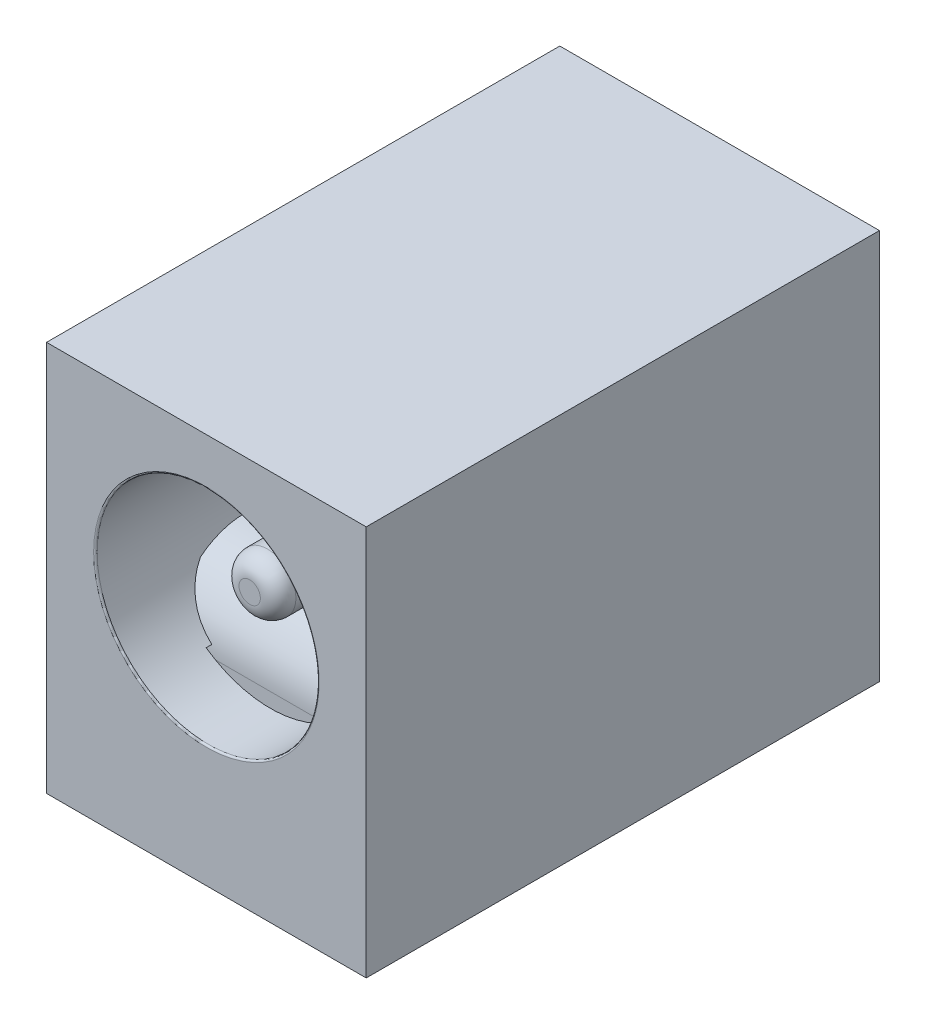
ISO-10303-21;
HEADER;
FILE_DESCRIPTION(('STEP AP214'),'2;1');
FILE_NAME('part.step','',(''),(''),'','','');
FILE_SCHEMA(('AUTOMOTIVE_DESIGN { 1 0 10303 214 1 1 1 1 }'));
ENDSEC;
DATA;
#1=APPLICATION_CONTEXT('core data for automotive mechanical design processes');
#2=APPLICATION_PROTOCOL_DEFINITION('international standard','automotive_design',2000,#1);
#3=PRODUCT_CONTEXT('',#1,'mechanical');
#4=PRODUCT('Part','Part','',(#3));
#5=PRODUCT_RELATED_PRODUCT_CATEGORY('part','',(#4));
#6=PRODUCT_DEFINITION_FORMATION('','',#4);
#7=PRODUCT_DEFINITION_CONTEXT('part definition',#1,'design');
#8=PRODUCT_DEFINITION('design','',#6,#7);
#9=PRODUCT_DEFINITION_SHAPE('','',#8);
#10=(LENGTH_UNIT() NAMED_UNIT(*) SI_UNIT(.MILLI.,.METRE.));
#11=(NAMED_UNIT(*) PLANE_ANGLE_UNIT() SI_UNIT($,.RADIAN.));
#12=(NAMED_UNIT(*) SI_UNIT($,.STERADIAN.) SOLID_ANGLE_UNIT());
#13=UNCERTAINTY_MEASURE_WITH_UNIT(LENGTH_MEASURE(1.E-05),#10,'distance_accuracy_value','');
#14=(GEOMETRIC_REPRESENTATION_CONTEXT(3) GLOBAL_UNCERTAINTY_ASSIGNED_CONTEXT((#13)) GLOBAL_UNIT_ASSIGNED_CONTEXT((#10,
#11,#12)) REPRESENTATION_CONTEXT('',''));
#15=CARTESIAN_POINT('',(0.,0.,0.));
#16=DIRECTION('',(0.,0.,1.));
#17=DIRECTION('',(1.,0.,0.));
#18=AXIS2_PLACEMENT_3D('',#15,#16,#17);
#19=CARTESIAN_POINT('',(9.,-5.5,-7.225));
#20=DIRECTION('',(0.,0.,1.));
#21=DIRECTION('',(1.,0.,0.));
#22=AXIS2_PLACEMENT_3D('',#19,#20,#21);
#23=PLANE('',#22);
#24=DIRECTION('',(0.,1.,0.));
#25=VECTOR('',#24,1.);
#26=CARTESIAN_POINT('',(0.,-5.5,-7.225));
#27=LINE('',#26,#25);
#28=CARTESIAN_POINT('',(0.,-5.5,-7.225));
#29=VERTEX_POINT('',#28);
#30=CARTESIAN_POINT('',(0.,5.5,-7.225));
#31=VERTEX_POINT('',#30);
#32=EDGE_CURVE('E268',#29,#31,#27,.T.);
#33=ORIENTED_EDGE('',*,*,#32,.T.);
#34=DIRECTION('',(-1.,0.,0.));
#35=VECTOR('',#34,1.);
#36=CARTESIAN_POINT('',(9.,5.5,-7.225));
#37=LINE('',#36,#35);
#38=CARTESIAN_POINT('',(9.,5.5,-7.225));
#39=VERTEX_POINT('',#38);
#40=EDGE_CURVE('E295',#39,#31,#37,.T.);
#41=ORIENTED_EDGE('',*,*,#40,.F.);
#42=DIRECTION('',(0.,1.,0.));
#43=VECTOR('',#42,1.);
#44=CARTESIAN_POINT('',(9.,-5.5,-7.225));
#45=LINE('',#44,#43);
#46=CARTESIAN_POINT('',(9.,-5.5,-7.225));
#47=VERTEX_POINT('',#46);
#48=EDGE_CURVE('E269',#47,#39,#45,.T.);
#49=ORIENTED_EDGE('',*,*,#48,.F.);
#50=DIRECTION('',(-1.,0.,0.));
#51=VECTOR('',#50,1.);
#52=CARTESIAN_POINT('',(9.,-5.5,-7.225));
#53=LINE('',#52,#51);
#54=EDGE_CURVE('E279',#47,#29,#53,.T.);
#55=ORIENTED_EDGE('',*,*,#54,.T.);
#56=EDGE_LOOP('',(#33,#41,#49,#55));
#57=FACE_BOUND('',#56,.T.);
#58=ADVANCED_FACE('F35',(#57),#23,.F.);
#59=CARTESIAN_POINT('',(9.,5.5,7.225));
#60=DIRECTION('',(0.,-1.,0.));
#61=DIRECTION('',(0.,0.,-1.));
#62=AXIS2_PLACEMENT_3D('',#59,#60,#61);
#63=PLANE('',#62);
#64=DIRECTION('',(0.,0.,1.));
#65=VECTOR('',#64,1.);
#66=CARTESIAN_POINT('',(0.,5.5,7.225));
#67=LINE('',#66,#65);
#68=CARTESIAN_POINT('',(0.,5.5,7.225));
#69=VERTEX_POINT('',#68);
#70=EDGE_CURVE('E282',#31,#69,#67,.T.);
#71=ORIENTED_EDGE('',*,*,#70,.T.);
#72=DIRECTION('',(-1.,0.,0.));
#73=VECTOR('',#72,1.);
#74=CARTESIAN_POINT('',(9.,5.5,7.225));
#75=LINE('',#74,#73);
#76=CARTESIAN_POINT('',(9.,5.5,7.225));
#77=VERTEX_POINT('',#76);
#78=EDGE_CURVE('E292',#77,#69,#75,.T.);
#79=ORIENTED_EDGE('',*,*,#78,.F.);
#80=DIRECTION('',(0.,0.,1.));
#81=VECTOR('',#80,1.);
#82=CARTESIAN_POINT('',(9.,5.5,7.225));
#83=LINE('',#82,#81);
#84=EDGE_CURVE('E272',#39,#77,#83,.T.);
#85=ORIENTED_EDGE('',*,*,#84,.F.);
#86=ORIENTED_EDGE('',*,*,#40,.T.);
#87=EDGE_LOOP('',(#71,#79,#85,#86));
#88=FACE_BOUND('',#87,.T.);
#89=ADVANCED_FACE('F376',(#88),#63,.F.);
#90=CARTESIAN_POINT('',(9.,-5.5,7.225));
#91=DIRECTION('',(0.,0.,-1.));
#92=DIRECTION('',(-1.,0.,0.));
#93=AXIS2_PLACEMENT_3D('',#90,#91,#92);
#94=PLANE('',#93);
#95=CARTESIAN_POINT('',(4.5,1.05,7.225));
#96=DIRECTION('',(0.,0.,-1.));
#97=DIRECTION('',(-1.,0.,0.));
#98=AXIS2_PLACEMENT_3D('',#95,#96,#97);
#99=CIRCLE('',#98,3.175);
#100=CARTESIAN_POINT('',(1.325,1.05,7.225));
#101=VERTEX_POINT('',#100);
#102=EDGE_CURVE('E307',#101,#101,#99,.T.);
#103=ORIENTED_EDGE('',*,*,#102,.T.);
#104=EDGE_LOOP('',(#103));
#105=FACE_BOUND('',#104,.T.);
#106=DIRECTION('',(0.,-1.,0.));
#107=VECTOR('',#106,1.);
#108=CARTESIAN_POINT('',(0.,-5.5,7.225));
#109=LINE('',#108,#107);
#110=CARTESIAN_POINT('',(0.,-5.5,7.225));
#111=VERTEX_POINT('',#110);
#112=EDGE_CURVE('E284',#69,#111,#109,.T.);
#113=ORIENTED_EDGE('',*,*,#112,.T.);
#114=DIRECTION('',(-1.,0.,0.));
#115=VECTOR('',#114,1.);
#116=CARTESIAN_POINT('',(9.,-5.5,7.225));
#117=LINE('',#116,#115);
#118=CARTESIAN_POINT('',(9.,-5.5,7.225));
#119=VERTEX_POINT('',#118);
#120=EDGE_CURVE('E289',#119,#111,#117,.T.);
#121=ORIENTED_EDGE('',*,*,#120,.F.);
#122=DIRECTION('',(0.,-1.,0.));
#123=VECTOR('',#122,1.);
#124=CARTESIAN_POINT('',(9.,-5.5,7.225));
#125=LINE('',#124,#123);
#126=EDGE_CURVE('E275',#77,#119,#125,.T.);
#127=ORIENTED_EDGE('',*,*,#126,.F.);
#128=ORIENTED_EDGE('',*,*,#78,.T.);
#129=EDGE_LOOP('',(#113,#121,#127,#128));
#130=FACE_BOUND('',#129,.T.);
#131=ADVANCED_FACE('F380',(#105,#130),#94,.F.);
#132=CARTESIAN_POINT('',(9.,-5.5,7.225));
#133=DIRECTION('',(0.,1.,0.));
#134=DIRECTION('',(0.,0.,1.));
#135=AXIS2_PLACEMENT_3D('',#132,#133,#134);
#136=PLANE('',#135);
#137=DIRECTION('',(-1.,0.,0.));
#138=VECTOR('',#137,1.);
#139=CARTESIAN_POINT('',(1.5,-5.5,5.425));
#140=LINE('',#139,#138);
#141=CARTESIAN_POINT('',(7.5,-5.5,5.425));
#142=VERTEX_POINT('',#141);
#143=CARTESIAN_POINT('',(1.5,-5.5,5.425));
#144=VERTEX_POINT('',#143);
#145=EDGE_CURVE('E246',#142,#144,#140,.T.);
#146=ORIENTED_EDGE('',*,*,#145,.F.);
#147=DIRECTION('',(0.,0.,1.));
#148=VECTOR('',#147,1.);
#149=CARTESIAN_POINT('',(7.5,-5.5,-0.575));
#150=LINE('',#149,#148);
#151=CARTESIAN_POINT('',(7.5,-5.5,-0.575));
#152=VERTEX_POINT('',#151);
#153=EDGE_CURVE('E229',#152,#142,#150,.T.);
#154=ORIENTED_EDGE('',*,*,#153,.F.);
#155=DIRECTION('',(1.,0.,0.));
#156=VECTOR('',#155,1.);
#157=CARTESIAN_POINT('',(1.5,-5.5,-0.575000000000001));
#158=LINE('',#157,#156);
#159=CARTESIAN_POINT('',(1.5,-5.5,-0.575000000000001));
#160=VERTEX_POINT('',#159);
#161=EDGE_CURVE('E234',#160,#152,#158,.T.);
#162=ORIENTED_EDGE('',*,*,#161,.F.);
#163=DIRECTION('',(0.,0.,-1.));
#164=VECTOR('',#163,1.);
#165=CARTESIAN_POINT('',(1.5,-5.5,5.425));
#166=LINE('',#165,#164);
#167=EDGE_CURVE('E249',#144,#160,#166,.T.);
#168=ORIENTED_EDGE('',*,*,#167,.F.);
#169=EDGE_LOOP('',(#146,#154,#162,#168));
#170=FACE_BOUND('',#169,.T.);
#171=DIRECTION('',(0.,0.,-1.));
#172=VECTOR('',#171,1.);
#173=CARTESIAN_POINT('',(0.,-5.5,7.225));
#174=LINE('',#173,#172);
#175=EDGE_CURVE('E273',#111,#29,#174,.T.);
#176=ORIENTED_EDGE('',*,*,#175,.T.);
#177=ORIENTED_EDGE('',*,*,#54,.F.);
#178=DIRECTION('',(0.,0.,-1.));
#179=VECTOR('',#178,1.);
#180=CARTESIAN_POINT('',(9.,-5.5,7.225));
#181=LINE('',#180,#179);
#182=EDGE_CURVE('E277',#119,#47,#181,.T.);
#183=ORIENTED_EDGE('',*,*,#182,.F.);
#184=ORIENTED_EDGE('',*,*,#120,.T.);
#185=EDGE_LOOP('',(#176,#177,#183,#184));
#186=FACE_BOUND('',#185,.T.);
#187=ADVANCED_FACE('F384',(#170,#186),#136,.F.);
#188=CARTESIAN_POINT('',(9.,0.,0.));
#189=DIRECTION('',(-1.,0.,0.));
#190=DIRECTION('',(0.,0.,1.));
#191=AXIS2_PLACEMENT_3D('',#188,#189,#190);
#192=PLANE('',#191);
#193=ORIENTED_EDGE('',*,*,#48,.T.);
#194=ORIENTED_EDGE('',*,*,#84,.T.);
#195=ORIENTED_EDGE('',*,*,#126,.T.);
#196=ORIENTED_EDGE('',*,*,#182,.T.);
#197=EDGE_LOOP('',(#193,#194,#195,#196));
#198=FACE_BOUND('',#197,.T.);
#199=ADVANCED_FACE('F388',(#198),#192,.F.);
#200=CARTESIAN_POINT('',(0.,0.,0.));
#201=DIRECTION('',(-1.,0.,0.));
#202=DIRECTION('',(0.,0.,1.));
#203=AXIS2_PLACEMENT_3D('',#200,#201,#202);
#204=PLANE('',#203);
#205=ORIENTED_EDGE('',*,*,#32,.F.);
#206=ORIENTED_EDGE('',*,*,#175,.F.);
#207=ORIENTED_EDGE('',*,*,#112,.F.);
#208=ORIENTED_EDGE('',*,*,#70,.F.);
#209=EDGE_LOOP('',(#205,#206,#207,#208));
#210=FACE_BOUND('',#209,.T.);
#211=ADVANCED_FACE('F390',(#210),#204,.T.);
#212=CARTESIAN_POINT('',(4.5,1.05,-1.705));
#213=DIRECTION('',(0.,0.,1.));
#214=DIRECTION('',(1.,0.,0.));
#215=AXIS2_PLACEMENT_3D('',#212,#213,#214);
#216=CYLINDRICAL_SURFACE('',#215,3.125);
#217=DIRECTION('',(0.,0.,1.));
#218=VECTOR('',#217,1.);
#219=CARTESIAN_POINT('',(6.30641218995001,-1.5,-1.705));
#220=LINE('',#219,#218);
#221=CARTESIAN_POINT('',(6.30641218995001,-1.5,-0.575));
#222=VERTEX_POINT('',#221);
#223=CARTESIAN_POINT('',(6.30641218995001,-1.5,-0.139860175548464));
#224=VERTEX_POINT('',#223);
#225=EDGE_CURVE('E57',#222,#224,#220,.T.);
#226=ORIENTED_EDGE('',*,*,#225,.T.);
#227=CARTESIAN_POINT('',(4.5,1.05,2.41013982445155));
#228=DIRECTION('',(0.,-0.707106781186549,0.707106781186546));
#229=DIRECTION('',(0.,0.707106781186546,0.707106781186549));
#230=AXIS2_PLACEMENT_3D('',#227,#228,#229);
#231=ELLIPSE('',#230,4.41941738241593,3.125);
#232=CARTESIAN_POINT('',(7.34426206933214,-0.244526276658168,1.11561354779337));
#233=VERTEX_POINT('',#232);
#234=EDGE_CURVE('E682',#224,#233,#231,.T.);
#235=ORIENTED_EDGE('',*,*,#234,.T.);
#236=DIRECTION('',(0.,0.,1.));
#237=VECTOR('',#236,1.);
#238=CARTESIAN_POINT('',(7.34426206933214,-0.244526276658168,-1.705));
#239=LINE('',#238,#237);
#240=CARTESIAN_POINT('',(7.34426206933214,-0.244526276658168,4.54704015311456));
#241=VERTEX_POINT('',#240);
#242=EDGE_CURVE('E221',#233,#241,#239,.T.);
#243=ORIENTED_EDGE('',*,*,#242,.T.);
#244=CARTESIAN_POINT('',(7.34426206933214,-0.244526276658168,4.54704015311456));
#245=CARTESIAN_POINT('',(7.32977712286333,-0.276360498626651,4.5864487091247));
#246=CARTESIAN_POINT('',(7.3140510822251,-0.309487116734059,4.62435313110626));
#247=CARTESIAN_POINT('',(7.2799954378134,-0.377831228575323,4.69695172335189));
#248=CARTESIAN_POINT('',(7.2616665473887,-0.413048147897698,4.73164676890401));
#249=CARTESIAN_POINT('',(7.22245324608999,-0.484772769270469,4.79734948460224));
#250=CARTESIAN_POINT('',(7.20159331175849,-0.52126600689631,4.82838752256777));
#251=CARTESIAN_POINT('',(7.15714916659731,-0.595312773892422,4.88703355541006));
#252=CARTESIAN_POINT('',(7.13356501292843,-0.632866281003154,4.9146416222308));
#253=CARTESIAN_POINT('',(7.05868523325267,-0.746363970367752,4.99227770838217));
#254=CARTESIAN_POINT('',(7.0032404690322,-0.82318650434868,5.03715440745007));
#255=CARTESIAN_POINT('',(6.8818690230584,-0.975301085177353,5.11391769327025));
#256=CARTESIAN_POINT('',(6.81590942233331,-1.05058745886503,5.14576232476864));
#257=CARTESIAN_POINT('',(6.67927325160331,-1.19174746589942,5.19650619139381));
#258=CARTESIAN_POINT('',(6.60915060053927,-1.25791530739224,5.21609112512709));
#259=CARTESIAN_POINT('',(6.49902952129858,-1.35246664834463,5.23941511975895));
#260=CARTESIAN_POINT('',(6.46157302268807,-1.38314823325014,5.24617398065689));
#261=CARTESIAN_POINT('',(6.38512046407508,-1.44284904852082,5.25794693589033));
#262=CARTESIAN_POINT('',(6.34612512724507,-1.47186904439304,5.26296183917249));
#263=CARTESIAN_POINT('',(6.30641218995001,-1.5,5.26723216887698));
#264=B_SPLINE_CURVE_WITH_KNOTS('',3,(#244,#245,#246,#247,#248,#249,#250,#251,#252,#253,#254,
#255,#256,#257,#258,#259,#260,#261,#262,#263),.UNSPECIFIED.,.F.,.F.,(4,2,2,2,2,2,2,2,2,4),(0.,
0.158015379323385,0.315987535517659,0.472538368343611,0.629085916945781,0.94200521721165,
1.25592414716176,1.5501879582617,1.69678175368278,1.84330745958371),.UNSPECIFIED.);
#265=CARTESIAN_POINT('',(6.30641218995001,-1.5,5.26723216887698));
#266=VERTEX_POINT('',#265);
#267=EDGE_CURVE('E348',#241,#266,#264,.T.);
#268=ORIENTED_EDGE('',*,*,#267,.T.);
#269=CARTESIAN_POINT('',(6.30641218995001,-1.5,5.425));
#270=VERTEX_POINT('',#269);
#271=EDGE_CURVE('E310',#266,#270,#220,.T.);
#272=ORIENTED_EDGE('',*,*,#271,.T.);
#273=CARTESIAN_POINT('',(4.5,1.05,5.425));
#274=DIRECTION('',(0.,0.,1.));
#275=DIRECTION('',(1.,0.,0.));
#276=AXIS2_PLACEMENT_3D('',#273,#274,#275);
#277=CIRCLE('',#276,3.125);
#278=CARTESIAN_POINT('',(2.69358781004999,-1.5,5.425));
#279=VERTEX_POINT('',#278);
#280=EDGE_CURVE('E312',#270,#279,#277,.F.);
#281=ORIENTED_EDGE('',*,*,#280,.T.);
#282=DIRECTION('',(0.,0.,1.));
#283=VECTOR('',#282,1.);
#284=CARTESIAN_POINT('',(2.69358781004999,-1.5,-1.705));
#285=LINE('',#284,#283);
#286=CARTESIAN_POINT('',(2.69358781004999,-1.5,5.26723216887698));
#287=VERTEX_POINT('',#286);
#288=EDGE_CURVE('E317',#279,#287,#285,.F.);
#289=ORIENTED_EDGE('',*,*,#288,.T.);
#290=CARTESIAN_POINT('',(2.69358781004999,-1.5,5.26723216887698));
#291=CARTESIAN_POINT('',(2.6428784769676,-1.46409139608874,5.26178088311461));
#292=CARTESIAN_POINT('',(2.59332300916467,-1.42670178931252,5.25511024528208));
#293=CARTESIAN_POINT('',(2.49675069740831,-1.34925722822402,5.23880944580129));
#294=CARTESIAN_POINT('',(2.44973717599444,-1.30919893132651,5.22917551582361));
#295=CARTESIAN_POINT('',(2.35842364500268,-1.22663803388993,5.20639195864334));
#296=CARTESIAN_POINT('',(2.31413556498096,-1.18412607562432,5.19322806365912));
#297=CARTESIAN_POINT('',(2.22882161910966,-1.09734277975819,5.16292918241532));
#298=CARTESIAN_POINT('',(2.18779395052329,-1.05307243499724,5.14579641142289));
#299=CARTESIAN_POINT('',(2.08169900481262,-0.931840298240547,5.09352116330998));
#300=CARTESIAN_POINT('',(2.01993194726743,-0.853708351837989,5.05417131868236));
#301=CARTESIAN_POINT('',(1.90791129760401,-0.698102968599253,4.96137840219348));
#302=CARTESIAN_POINT('',(1.85761001182917,-0.620628144302707,4.90799577594812));
#303=CARTESIAN_POINT('',(1.78126328351594,-0.492071072174262,4.80447055521127));
#304=CARTESIAN_POINT('',(1.75240525375674,-0.439817330521518,4.75782787284207));
#305=CARTESIAN_POINT('',(1.71319266662416,-0.364263573032052,4.68267507880531));
#306=CARTESIAN_POINT('',(1.70077466201343,-0.33949104989925,4.65668694931493));
#307=CARTESIAN_POINT('',(1.6772709047836,-0.291100159427677,4.60307284829653));
#308=CARTESIAN_POINT('',(1.66618545092049,-0.267482051608853,4.57544651155026));
#309=CARTESIAN_POINT('',(1.65573793066786,-0.244526276658172,4.54704015311457));
#310=B_SPLINE_CURVE_WITH_KNOTS('',3,(#290,#291,#292,#293,#294,#295,#296,#297,#298,#299,#300,
#301,#302,#303,#304,#305,#306,#307,#308,#309),.UNSPECIFIED.,.F.,.F.,(4,2,2,2,2,2,2,2,2,4),(0.,
0.187115060142361,0.37446905957194,0.562592048282088,0.750610286223948,1.07037845818407,
1.38879119174335,1.61544004837144,1.72934247595145,1.84327039285311),.UNSPECIFIED.);
#311=CARTESIAN_POINT('',(1.65573793066786,-0.244526276658172,4.54704015311457));
#312=VERTEX_POINT('',#311);
#313=EDGE_CURVE('E341',#287,#312,#310,.T.);
#314=ORIENTED_EDGE('',*,*,#313,.T.);
#315=DIRECTION('',(0.,0.,1.));
#316=VECTOR('',#315,1.);
#317=CARTESIAN_POINT('',(1.65573793066786,-0.244526276658172,-1.705));
#318=LINE('',#317,#316);
#319=CARTESIAN_POINT('',(1.65573793066786,-0.244526276658172,1.11561354779337));
#320=VERTEX_POINT('',#319);
#321=EDGE_CURVE('E226',#312,#320,#318,.F.);
#322=ORIENTED_EDGE('',*,*,#321,.T.);
#323=CARTESIAN_POINT('',(4.5,1.05,2.41013982445155));
#324=DIRECTION('',(0.,-0.707106781186549,0.707106781186546));
#325=DIRECTION('',(0.,0.707106781186546,0.707106781186549));
#326=AXIS2_PLACEMENT_3D('',#323,#324,#325);
#327=ELLIPSE('',#326,4.41941738241593,3.125);
#328=CARTESIAN_POINT('',(2.69358781004999,-1.5,-0.139860175548464));
#329=VERTEX_POINT('',#328);
#330=EDGE_CURVE('E43',#320,#329,#327,.T.);
#331=ORIENTED_EDGE('',*,*,#330,.T.);
#332=CARTESIAN_POINT('',(2.69358781004999,-1.5,-0.575000000000001));
#333=VERTEX_POINT('',#332);
#334=EDGE_CURVE('E49',#329,#333,#285,.F.);
#335=ORIENTED_EDGE('',*,*,#334,.T.);
#336=CARTESIAN_POINT('',(4.5,1.05,-0.575));
#337=DIRECTION('',(0.,0.,-1.));
#338=DIRECTION('',(-1.,0.,0.));
#339=AXIS2_PLACEMENT_3D('',#336,#337,#338);
#340=CIRCLE('',#339,3.125);
#341=EDGE_CURVE('E315',#333,#222,#340,.F.);
#342=ORIENTED_EDGE('',*,*,#341,.T.);
#343=EDGE_LOOP('',(#226,#235,#243,#268,#272,#281,#289,#314,#322,#331,#335,#342));
#344=FACE_BOUND('',#343,.T.);
#345=CARTESIAN_POINT('',(4.5,1.05,7.175));
#346=DIRECTION('',(0.,0.,-1.));
#347=DIRECTION('',(-1.,0.,0.));
#348=AXIS2_PLACEMENT_3D('',#345,#346,#347);
#349=CIRCLE('',#348,3.125);
#350=CARTESIAN_POINT('',(1.375,1.05,7.175));
#351=VERTEX_POINT('',#350);
#352=EDGE_CURVE('E304',#351,#351,#349,.F.);
#353=ORIENTED_EDGE('',*,*,#352,.T.);
#354=EDGE_LOOP('',(#353));
#355=FACE_BOUND('',#354,.T.);
#356=CARTESIAN_POINT('',(4.5,1.05,-1.705));
#357=DIRECTION('',(0.,0.,1.));
#358=DIRECTION('',(1.,0.,0.));
#359=AXIS2_PLACEMENT_3D('',#356,#357,#358);
#360=CIRCLE('',#359,3.125);
#361=CARTESIAN_POINT('',(7.625,1.05,-1.705));
#362=VERTEX_POINT('',#361);
#363=EDGE_CURVE('E265',#362,#362,#360,.T.);
#364=ORIENTED_EDGE('',*,*,#363,.F.);
#365=EDGE_LOOP('',(#364));
#366=FACE_BOUND('',#365,.T.);
#367=ADVANCED_FACE('F354',(#344,#355,#366),#216,.F.);
#368=CARTESIAN_POINT('',(4.5,1.05,-1.705));
#369=DIRECTION('',(0.,0.,1.));
#370=DIRECTION('',(1.,0.,0.));
#371=AXIS2_PLACEMENT_3D('',#368,#369,#370);
#372=PLANE('',#371);
#373=CARTESIAN_POINT('',(4.5,1.05,-1.705));
#374=DIRECTION('',(0.,0.,1.));
#375=DIRECTION('',(1.,0.,0.));
#376=AXIS2_PLACEMENT_3D('',#373,#374,#375);
#377=CIRCLE('',#376,0.8);
#378=CARTESIAN_POINT('',(3.7,1.05,-1.705));
#379=VERTEX_POINT('',#378);
#380=EDGE_CURVE('E256',#379,#379,#377,.T.);
#381=ORIENTED_EDGE('',*,*,#380,.F.);
#382=EDGE_LOOP('',(#381));
#383=FACE_BOUND('',#382,.T.);
#384=ORIENTED_EDGE('',*,*,#363,.T.);
#385=EDGE_LOOP('',(#384));
#386=FACE_BOUND('',#385,.T.);
#387=ADVANCED_FACE('F425',(#383,#386),#372,.T.);
#388=CARTESIAN_POINT('',(4.5,1.05,6.005));
#389=DIRECTION('',(0.,0.,-1.));
#390=DIRECTION('',(-1.,0.,0.));
#391=AXIS2_PLACEMENT_3D('',#388,#389,#390);
#392=CYLINDRICAL_SURFACE('',#391,0.8);
#393=CARTESIAN_POINT('',(4.5,1.05,5.505));
#394=DIRECTION('',(0.,0.,1.));
#395=DIRECTION('',(1.,0.,0.));
#396=AXIS2_PLACEMENT_3D('',#393,#394,#395);
#397=CIRCLE('',#396,0.8);
#398=CARTESIAN_POINT('',(3.7,1.05,5.505));
#399=VERTEX_POINT('',#398);
#400=EDGE_CURVE('E301',#399,#399,#397,.F.);
#401=CARTESIAN_POINT('',(3.7,1.05,5.505));
#402=CARTESIAN_POINT('',(3.7,1.05,5.42989583333333));
#403=CARTESIAN_POINT('',(3.7,1.05,5.35479166666666));
#404=CARTESIAN_POINT('',(3.7,1.05,5.20458333333333));
#405=CARTESIAN_POINT('',(3.7,1.05,5.12947916666666));
#406=CARTESIAN_POINT('',(3.7,1.05,4.97927083333333));
#407=CARTESIAN_POINT('',(3.7,1.05,4.90416666666666));
#408=CARTESIAN_POINT('',(3.7,1.05,4.75395833333333));
#409=CARTESIAN_POINT('',(3.7,1.05,4.67885416666666));
#410=CARTESIAN_POINT('',(3.7,1.05,4.52864583333333));
#411=CARTESIAN_POINT('',(3.7,1.05,4.45354166666666));
#412=CARTESIAN_POINT('',(3.7,1.05,4.30333333333333));
#413=CARTESIAN_POINT('',(3.7,1.05,4.22822916666666));
#414=CARTESIAN_POINT('',(3.7,1.05,4.07802083333333));
#415=CARTESIAN_POINT('',(3.7,1.05,4.00291666666666));
#416=CARTESIAN_POINT('',(3.7,1.05,3.85270833333333));
#417=CARTESIAN_POINT('',(3.7,1.05,3.77760416666666));
#418=CARTESIAN_POINT('',(3.7,1.05,3.62739583333333));
#419=CARTESIAN_POINT('',(3.7,1.05,3.55229166666666));
#420=CARTESIAN_POINT('',(3.7,1.05,3.40208333333333));
#421=CARTESIAN_POINT('',(3.7,1.05,3.32697916666666));
#422=CARTESIAN_POINT('',(3.7,1.05,3.17677083333333));
#423=CARTESIAN_POINT('',(3.7,1.05,3.10166666666666));
#424=CARTESIAN_POINT('',(3.7,1.05,2.95145833333333));
#425=CARTESIAN_POINT('',(3.7,1.05,2.87635416666666));
#426=CARTESIAN_POINT('',(3.7,1.05,2.72614583333333));
#427=CARTESIAN_POINT('',(3.7,1.05,2.65104166666666));
#428=CARTESIAN_POINT('',(3.7,1.05,2.50083333333333));
#429=CARTESIAN_POINT('',(3.7,1.05,2.42572916666666));
#430=CARTESIAN_POINT('',(3.7,1.05,2.27552083333333));
#431=CARTESIAN_POINT('',(3.7,1.05,2.20041666666666));
#432=CARTESIAN_POINT('',(3.7,1.05,2.05020833333333));
#433=CARTESIAN_POINT('',(3.7,1.05,1.97510416666666));
#434=CARTESIAN_POINT('',(3.7,1.05,1.82489583333333));
#435=CARTESIAN_POINT('',(3.7,1.05,1.74979166666666));
#436=CARTESIAN_POINT('',(3.7,1.05,1.59958333333333));
#437=CARTESIAN_POINT('',(3.7,1.05,1.52447916666666));
#438=CARTESIAN_POINT('',(3.7,1.05,1.37427083333333));
#439=CARTESIAN_POINT('',(3.7,1.05,1.29916666666666));
#440=CARTESIAN_POINT('',(3.7,1.05,1.14895833333333));
#441=CARTESIAN_POINT('',(3.7,1.05,1.07385416666666));
#442=CARTESIAN_POINT('',(3.7,1.05,0.923645833333331));
#443=CARTESIAN_POINT('',(3.7,1.05,0.848541666666664));
#444=CARTESIAN_POINT('',(3.7,1.05,0.698333333333331));
#445=CARTESIAN_POINT('',(3.7,1.05,0.623229166666664));
#446=CARTESIAN_POINT('',(3.7,1.05,0.473020833333331));
#447=CARTESIAN_POINT('',(3.7,1.05,0.397916666666664));
#448=CARTESIAN_POINT('',(3.7,1.05,0.247708333333331));
#449=CARTESIAN_POINT('',(3.7,1.05,0.172604166666664));
#450=CARTESIAN_POINT('',(3.7,1.05,0.0223958333333312));
#451=CARTESIAN_POINT('',(3.7,1.05,-0.0527083333333354));
#452=CARTESIAN_POINT('',(3.7,1.05,-0.202916666666669));
#453=CARTESIAN_POINT('',(3.7,1.05,-0.278020833333336));
#454=CARTESIAN_POINT('',(3.7,1.05,-0.428229166666669));
#455=CARTESIAN_POINT('',(3.7,1.05,-0.503333333333336));
#456=CARTESIAN_POINT('',(3.7,1.05,-0.653541666666669));
#457=CARTESIAN_POINT('',(3.7,1.05,-0.728645833333336));
#458=CARTESIAN_POINT('',(3.7,1.05,-0.878854166666669));
#459=CARTESIAN_POINT('',(3.7,1.05,-0.953958333333336));
#460=CARTESIAN_POINT('',(3.7,1.05,-1.10416666666667));
#461=CARTESIAN_POINT('',(3.7,1.05,-1.17927083333334));
#462=CARTESIAN_POINT('',(3.7,1.05,-1.32947916666667));
#463=CARTESIAN_POINT('',(3.7,1.05,-1.40458333333334));
#464=CARTESIAN_POINT('',(3.7,1.05,-1.55479166666667));
#465=CARTESIAN_POINT('',(3.7,1.05,-1.62989583333334));
#466=CARTESIAN_POINT('',(3.7,1.05,-1.705));
#467=B_SPLINE_CURVE_WITH_KNOTS('',3,(#401,#402,#403,#404,#405,#406,#407,#408,#409,#410,#411,
#412,#413,#414,#415,#416,#417,#418,#419,#420,#421,#422,#423,#424,#425,#426,#427,#428,#429,#430,
#431,#432,#433,#434,#435,#436,#437,#438,#439,#440,#441,#442,#443,#444,#445,#446,#447,#448,#449,
#450,#451,#452,#453,#454,#455,#456,#457,#458,#459,#460,#461,#462,#463,#464,#465,#466),
.UNSPECIFIED.,.F.,.F.,(4,2,2,2,2,2,2,2,2,2,2,2,2,2,2,2,2,2,2,2,2,2,2,2,2,2,2,2,2,2,2,2,4),(0.,
0.2253125,0.450625,0.675937499999999,0.901249999999999,1.1265625,1.351875,1.5771875,1.8025,
2.0278125,2.253125,2.4784375,2.70375,2.9290625,3.154375,3.3796875,3.605,3.8303125,4.055625,
4.2809375,4.50625,4.7315625,4.956875,5.1821875,5.4075,5.6328125,5.858125,6.0834375,6.30875,
6.5340625,6.759375,6.9846875,7.21),.UNSPECIFIED.);
#468=EDGE_CURVE('BSEAM433',#399,#379,#467,.T.);
#469=ORIENTED_EDGE('',*,*,#400,.T.);
#470=ORIENTED_EDGE('',*,*,#380,.T.);
#471=ORIENTED_EDGE('',*,*,#468,.T.);
#472=ORIENTED_EDGE('',*,*,#468,.F.);
#473=EDGE_LOOP('',(#469,#471,#470,#472));
#474=FACE_BOUND('',#473,.T.);
#475=ADVANCED_FACE('F433',(#474),#392,.T.);
#476=CARTESIAN_POINT('',(4.5,1.05,6.005));
#477=DIRECTION('',(0.,0.,1.));
#478=DIRECTION('',(1.,0.,0.));
#479=AXIS2_PLACEMENT_3D('',#476,#477,#478);
#480=PLANE('',#479);
#481=CARTESIAN_POINT('',(4.5,1.05,6.005));
#482=DIRECTION('',(0.,0.,1.));
#483=DIRECTION('',(1.,0.,0.));
#484=AXIS2_PLACEMENT_3D('',#481,#482,#483);
#485=CIRCLE('',#484,0.3);
#486=CARTESIAN_POINT('',(4.8,1.05,6.005));
#487=VERTEX_POINT('',#486);
#488=EDGE_CURVE('E298',#487,#487,#485,.T.);
#489=ORIENTED_EDGE('',*,*,#488,.T.);
#490=EDGE_LOOP('',(#489));
#491=FACE_BOUND('',#490,.T.);
#492=ADVANCED_FACE('F372',(#491),#480,.T.);
#493=CARTESIAN_POINT('',(4.5,1.05,5.505));
#494=DIRECTION('',(0.,0.,1.));
#495=DIRECTION('',(1.,0.,0.));
#496=AXIS2_PLACEMENT_3D('',#493,#494,#495);
#497=DEGENERATE_TOROIDAL_SURFACE('',#496,0.3,0.5,.T.);
#498=ORIENTED_EDGE('',*,*,#400,.F.);
#499=EDGE_LOOP('',(#498));
#500=FACE_BOUND('',#499,.T.);
#501=ORIENTED_EDGE('',*,*,#488,.F.);
#502=EDGE_LOOP('',(#501));
#503=FACE_BOUND('',#502,.T.);
#504=ADVANCED_FACE('F368',(#500,#503),#497,.T.);
#505=CARTESIAN_POINT('',(4.5,1.05,7.175));
#506=DIRECTION('',(0.,0.,-1.));
#507=DIRECTION('',(-1.,0.,0.));
#508=AXIS2_PLACEMENT_3D('',#505,#506,#507);
#509=TOROIDAL_SURFACE('',#508,3.175,0.05);
#510=ORIENTED_EDGE('',*,*,#102,.F.);
#511=EDGE_LOOP('',(#510));
#512=FACE_BOUND('',#511,.T.);
#513=ORIENTED_EDGE('',*,*,#352,.F.);
#514=EDGE_LOOP('',(#513));
#515=FACE_BOUND('',#514,.T.);
#516=ADVANCED_FACE('F363',(#512,#515),#509,.T.);
#517=CARTESIAN_POINT('',(1.5,-1.5,-0.575000000000001));
#518=DIRECTION('',(0.,0.,-1.));
#519=DIRECTION('',(-1.,0.,0.));
#520=AXIS2_PLACEMENT_3D('',#517,#518,#519);
#521=PLANE('',#520);
#522=DIRECTION('',(1.,0.,0.));
#523=VECTOR('',#522,1.);
#524=CARTESIAN_POINT('',(1.5,-1.5,-0.575000000000001));
#525=LINE('',#524,#523);
#526=CARTESIAN_POINT('',(1.5,-1.5,-0.575000000000001));
#527=VERTEX_POINT('',#526);
#528=EDGE_CURVE('E242',#527,#333,#525,.T.);
#529=ORIENTED_EDGE('',*,*,#528,.F.);
#530=DIRECTION('',(0.,-1.,0.));
#531=VECTOR('',#530,1.);
#532=CARTESIAN_POINT('',(1.5,-1.5,-0.575000000000001));
#533=LINE('',#532,#531);
#534=EDGE_CURVE('E257',#527,#160,#533,.T.);
#535=ORIENTED_EDGE('',*,*,#534,.T.);
#536=ORIENTED_EDGE('',*,*,#161,.T.);
#537=DIRECTION('',(0.,-1.,0.));
#538=VECTOR('',#537,1.);
#539=CARTESIAN_POINT('',(7.5,-1.5,-0.575));
#540=LINE('',#539,#538);
#541=CARTESIAN_POINT('',(7.5,-1.5,-0.575));
#542=VERTEX_POINT('',#541);
#543=EDGE_CURVE('E254',#542,#152,#540,.T.);
#544=ORIENTED_EDGE('',*,*,#543,.F.);
#545=EDGE_CURVE('E241',#222,#542,#525,.T.);
#546=ORIENTED_EDGE('',*,*,#545,.F.);
#547=ORIENTED_EDGE('',*,*,#341,.F.);
#548=EDGE_LOOP('',(#529,#535,#536,#544,#546,#547));
#549=FACE_BOUND('',#548,.T.);
#550=ADVANCED_FACE('F367',(#549),#521,.F.);
#551=CARTESIAN_POINT('',(1.5,-1.5,5.425));
#552=DIRECTION('',(0.,0.,1.));
#553=DIRECTION('',(1.,0.,0.));
#554=AXIS2_PLACEMENT_3D('',#551,#552,#553);
#555=PLANE('',#554);
#556=DIRECTION('',(-1.,0.,0.));
#557=VECTOR('',#556,1.);
#558=CARTESIAN_POINT('',(1.5,-1.5,5.425));
#559=LINE('',#558,#557);
#560=CARTESIAN_POINT('',(7.5,-1.5,5.425));
#561=VERTEX_POINT('',#560);
#562=EDGE_CURVE('E235',#561,#270,#559,.T.);
#563=ORIENTED_EDGE('',*,*,#562,.F.);
#564=DIRECTION('',(0.,-1.,0.));
#565=VECTOR('',#564,1.);
#566=CARTESIAN_POINT('',(7.5,-1.5,5.425));
#567=LINE('',#566,#565);
#568=EDGE_CURVE('E244',#561,#142,#567,.T.);
#569=ORIENTED_EDGE('',*,*,#568,.T.);
#570=ORIENTED_EDGE('',*,*,#145,.T.);
#571=DIRECTION('',(0.,-1.,0.));
#572=VECTOR('',#571,1.);
#573=CARTESIAN_POINT('',(1.5,-1.5,5.425));
#574=LINE('',#573,#572);
#575=CARTESIAN_POINT('',(1.5,-1.5,5.425));
#576=VERTEX_POINT('',#575);
#577=EDGE_CURVE('E259',#576,#144,#574,.T.);
#578=ORIENTED_EDGE('',*,*,#577,.F.);
#579=EDGE_CURVE('E233',#279,#576,#559,.T.);
#580=ORIENTED_EDGE('',*,*,#579,.F.);
#581=ORIENTED_EDGE('',*,*,#280,.F.);
#582=EDGE_LOOP('',(#563,#569,#570,#578,#580,#581));
#583=FACE_BOUND('',#582,.T.);
#584=ADVANCED_FACE('F463',(#583),#555,.F.);
#585=CARTESIAN_POINT('',(0.,-1.5,0.));
#586=DIRECTION('',(0.,1.,0.));
#587=DIRECTION('',(0.,0.,1.));
#588=AXIS2_PLACEMENT_3D('',#585,#586,#587);
#589=PLANE('',#588);
#590=ORIENTED_EDGE('',*,*,#334,.F.);
#591=DIRECTION('',(1.,0.,0.));
#592=VECTOR('',#591,1.);
#593=CARTESIAN_POINT('',(0.,-1.5,-0.139860175548464));
#594=LINE('',#593,#592);
#595=CARTESIAN_POINT('',(1.65573793066786,-1.5,-0.139860175548464));
#596=VERTEX_POINT('',#595);
#597=EDGE_CURVE('E11',#329,#596,#594,.F.);
#598=ORIENTED_EDGE('',*,*,#597,.T.);
#599=DIRECTION('',(0.,0.,1.));
#600=VECTOR('',#599,1.);
#601=CARTESIAN_POINT('',(1.65573793066786,-1.5,0.));
#602=LINE('',#601,#600);
#603=CARTESIAN_POINT('',(1.65573793066786,-1.5,5.26723216887698));
#604=VERTEX_POINT('',#603);
#605=EDGE_CURVE('E322',#596,#604,#602,.T.);
#606=ORIENTED_EDGE('',*,*,#605,.T.);
#607=DIRECTION('',(-1.,0.,0.));
#608=VECTOR('',#607,1.);
#609=CARTESIAN_POINT('',(1.65573793066786,-1.5,5.26723216887698));
#610=LINE('',#609,#608);
#611=EDGE_CURVE('E338',#604,#287,#610,.F.);
#612=ORIENTED_EDGE('',*,*,#611,.T.);
#613=ORIENTED_EDGE('',*,*,#288,.F.);
#614=ORIENTED_EDGE('',*,*,#579,.T.);
#615=DIRECTION('',(0.,0.,-1.));
#616=VECTOR('',#615,1.);
#617=CARTESIAN_POINT('',(1.5,-1.5,5.425));
#618=LINE('',#617,#616);
#619=EDGE_CURVE('E238',#576,#527,#618,.T.);
#620=ORIENTED_EDGE('',*,*,#619,.T.);
#621=ORIENTED_EDGE('',*,*,#528,.T.);
#622=EDGE_LOOP('',(#590,#598,#606,#612,#613,#614,#620,#621));
#623=FACE_BOUND('',#622,.T.);
#624=ADVANCED_FACE('F472',(#623),#589,.F.);
#625=ORIENTED_EDGE('',*,*,#271,.F.);
#626=DIRECTION('',(-1.,0.,0.));
#627=VECTOR('',#626,1.);
#628=CARTESIAN_POINT('',(6.30641218995001,-1.5,5.26723216887698));
#629=LINE('',#628,#627);
#630=CARTESIAN_POINT('',(7.34426206933214,-1.5,5.26723216887698));
#631=VERTEX_POINT('',#630);
#632=EDGE_CURVE('E714',#266,#631,#629,.F.);
#633=ORIENTED_EDGE('',*,*,#632,.T.);
#634=DIRECTION('',(0.,0.,-1.));
#635=VECTOR('',#634,1.);
#636=CARTESIAN_POINT('',(7.34426206933214,-1.5,0.));
#637=LINE('',#636,#635);
#638=CARTESIAN_POINT('',(7.34426206933214,-1.5,-0.139860175548464));
#639=VERTEX_POINT('',#638);
#640=EDGE_CURVE('E319',#631,#639,#637,.T.);
#641=ORIENTED_EDGE('',*,*,#640,.T.);
#642=DIRECTION('',(1.,0.,0.));
#643=VECTOR('',#642,1.);
#644=CARTESIAN_POINT('',(0.,-1.5,-0.139860175548464));
#645=LINE('',#644,#643);
#646=EDGE_CURVE('E675',#639,#224,#645,.F.);
#647=ORIENTED_EDGE('',*,*,#646,.T.);
#648=ORIENTED_EDGE('',*,*,#225,.F.);
#649=ORIENTED_EDGE('',*,*,#545,.T.);
#650=DIRECTION('',(0.,0.,1.));
#651=VECTOR('',#650,1.);
#652=CARTESIAN_POINT('',(7.5,-1.5,-0.575));
#653=LINE('',#652,#651);
#654=EDGE_CURVE('E230',#542,#561,#653,.T.);
#655=ORIENTED_EDGE('',*,*,#654,.T.);
#656=ORIENTED_EDGE('',*,*,#562,.T.);
#657=EDGE_LOOP('',(#625,#633,#641,#647,#648,#649,#655,#656));
#658=FACE_BOUND('',#657,.T.);
#659=ADVANCED_FACE('F480',(#658),#589,.F.);
#660=CARTESIAN_POINT('',(7.5,-1.5,-0.575));
#661=DIRECTION('',(1.,0.,0.));
#662=DIRECTION('',(0.,0.,-1.));
#663=AXIS2_PLACEMENT_3D('',#660,#661,#662);
#664=PLANE('',#663);
#665=ORIENTED_EDGE('',*,*,#153,.T.);
#666=ORIENTED_EDGE('',*,*,#568,.F.);
#667=ORIENTED_EDGE('',*,*,#654,.F.);
#668=ORIENTED_EDGE('',*,*,#543,.T.);
#669=EDGE_LOOP('',(#665,#666,#667,#668));
#670=FACE_BOUND('',#669,.T.);
#671=ADVANCED_FACE('F487',(#670),#664,.F.);
#672=CARTESIAN_POINT('',(1.5,-1.5,5.425));
#673=DIRECTION('',(-1.,0.,0.));
#674=DIRECTION('',(0.,0.,1.));
#675=AXIS2_PLACEMENT_3D('',#672,#673,#674);
#676=PLANE('',#675);
#677=ORIENTED_EDGE('',*,*,#167,.T.);
#678=ORIENTED_EDGE('',*,*,#534,.F.);
#679=ORIENTED_EDGE('',*,*,#619,.F.);
#680=ORIENTED_EDGE('',*,*,#577,.T.);
#681=EDGE_LOOP('',(#677,#678,#679,#680));
#682=FACE_BOUND('',#681,.T.);
#683=ADVANCED_FACE('F494',(#682),#676,.F.);
#684=CARTESIAN_POINT('',(1.65573793066786,0.2,-0.439860175548464));
#685=DIRECTION('',(-1.,0.,0.));
#686=DIRECTION('',(0.,0.,1.));
#687=AXIS2_PLACEMENT_3D('',#684,#685,#686);
#688=PLANE('',#687);
#689=DIRECTION('',(0.,0.,-1.));
#690=VECTOR('',#689,1.);
#691=CARTESIAN_POINT('',(1.65573793066786,0.2,-0.439860175548464));
#692=LINE('',#691,#690);
#693=CARTESIAN_POINT('',(1.65573793066786,0.2,3.28986017554846));
#694=VERTEX_POINT('',#693);
#695=CARTESIAN_POINT('',(1.65573793066786,0.2,1.56013982445154));
#696=VERTEX_POINT('',#695);
#697=EDGE_CURVE('E196',#694,#696,#692,.T.);
#698=ORIENTED_EDGE('',*,*,#697,.T.);
#699=DIRECTION('',(0.,0.707106781186546,0.707106781186549));
#700=VECTOR('',#699,1.);
#701=CARTESIAN_POINT('',(1.65573793066786,-0.800000000000003,0.560139824451535));
#702=LINE('',#701,#700);
#703=EDGE_CURVE('E668',#696,#320,#702,.F.);
#704=ORIENTED_EDGE('',*,*,#703,.T.);
#705=ORIENTED_EDGE('',*,*,#321,.F.);
#706=CARTESIAN_POINT('',(1.65573793066786,-1.8,3.28986017554846));
#707=DIRECTION('',(-1.,0.,0.));
#708=DIRECTION('',(0.,0.,1.));
#709=AXIS2_PLACEMENT_3D('',#706,#707,#708);
#710=CIRCLE('',#709,2.);
#711=EDGE_CURVE('E329',#312,#694,#710,.T.);
#712=ORIENTED_EDGE('',*,*,#711,.T.);
#713=EDGE_LOOP('',(#698,#704,#705,#712));
#714=FACE_BOUND('',#713,.T.);
#715=ADVANCED_FACE('F502',(#714),#688,.T.);
#716=ORIENTED_EDGE('',*,*,#605,.F.);
#717=DIRECTION('',(0.,0.707106781186546,0.707106781186549));
#718=VECTOR('',#717,1.);
#719=CARTESIAN_POINT('',(1.65573793066786,-0.800000000000003,0.560139824451535));
#720=LINE('',#719,#718);
#721=CARTESIAN_POINT('',(1.65573793066786,-1.8,-0.439860175548464));
#722=VERTEX_POINT('',#721);
#723=EDGE_CURVE('E673',#596,#722,#720,.F.);
#724=ORIENTED_EDGE('',*,*,#723,.T.);
#725=DIRECTION('',(0.,-1.,0.));
#726=VECTOR('',#725,1.);
#727=CARTESIAN_POINT('',(1.65573793066786,0.2,-0.439860175548464));
#728=LINE('',#727,#726);
#729=CARTESIAN_POINT('',(1.65573793066786,-5.5,-0.439860175548464));
#730=VERTEX_POINT('',#729);
#731=EDGE_CURVE('E222',#722,#730,#728,.T.);
#732=ORIENTED_EDGE('',*,*,#731,.T.);
#733=DIRECTION('',(0.,0.,-1.));
#734=VECTOR('',#733,1.);
#735=CARTESIAN_POINT('',(1.65573793066786,-5.5,-0.439860175548464));
#736=LINE('',#735,#734);
#737=CARTESIAN_POINT('',(1.65573793066786,-5.5,5.28986017554846));
#738=VERTEX_POINT('',#737);
#739=EDGE_CURVE('E205',#738,#730,#736,.T.);
#740=ORIENTED_EDGE('',*,*,#739,.F.);
#741=DIRECTION('',(0.,-1.,0.));
#742=VECTOR('',#741,1.);
#743=CARTESIAN_POINT('',(1.65573793066786,0.2,5.28986017554846));
#744=LINE('',#743,#742);
#745=CARTESIAN_POINT('',(1.65573793066786,-1.8,5.28986017554846));
#746=VERTEX_POINT('',#745);
#747=EDGE_CURVE('E195',#746,#738,#744,.T.);
#748=ORIENTED_EDGE('',*,*,#747,.F.);
#749=CARTESIAN_POINT('',(1.65573793066786,-1.8,3.28986017554846));
#750=DIRECTION('',(-1.,0.,0.));
#751=DIRECTION('',(0.,0.,1.));
#752=AXIS2_PLACEMENT_3D('',#749,#750,#751);
#753=CIRCLE('',#752,2.);
#754=EDGE_CURVE('E326',#746,#604,#753,.T.);
#755=ORIENTED_EDGE('',*,*,#754,.T.);
#756=EDGE_LOOP('',(#716,#724,#732,#740,#748,#755));
#757=FACE_BOUND('',#756,.T.);
#758=ADVANCED_FACE('F510',(#757),#688,.T.);
#759=CARTESIAN_POINT('',(7.34426206933214,0.2,-0.439860175548464));
#760=DIRECTION('',(1.,0.,0.));
#761=DIRECTION('',(0.,0.,-1.));
#762=AXIS2_PLACEMENT_3D('',#759,#760,#761);
#763=PLANE('',#762);
#764=ORIENTED_EDGE('',*,*,#242,.F.);
#765=DIRECTION('',(0.,-0.707106781186546,-0.707106781186549));
#766=VECTOR('',#765,1.);
#767=CARTESIAN_POINT('',(7.34426206933214,-0.800000000000003,0.560139824451535));
#768=LINE('',#767,#766);
#769=CARTESIAN_POINT('',(7.34426206933214,0.2,1.56013982445154));
#770=VERTEX_POINT('',#769);
#771=EDGE_CURVE('E677',#233,#770,#768,.F.);
#772=ORIENTED_EDGE('',*,*,#771,.T.);
#773=DIRECTION('',(0.,0.,1.));
#774=VECTOR('',#773,1.);
#775=CARTESIAN_POINT('',(7.34426206933214,0.2,-0.439860175548464));
#776=LINE('',#775,#774);
#777=CARTESIAN_POINT('',(7.34426206933214,0.2,3.28986017554846));
#778=VERTEX_POINT('',#777);
#779=EDGE_CURVE('E215',#770,#778,#776,.T.);
#780=ORIENTED_EDGE('',*,*,#779,.T.);
#781=CARTESIAN_POINT('',(7.34426206933214,-1.8,3.28986017554846));
#782=DIRECTION('',(1.,0.,0.));
#783=DIRECTION('',(0.,0.,-1.));
#784=AXIS2_PLACEMENT_3D('',#781,#782,#783);
#785=CIRCLE('',#784,2.);
#786=EDGE_CURVE('E334',#778,#241,#785,.T.);
#787=ORIENTED_EDGE('',*,*,#786,.T.);
#788=EDGE_LOOP('',(#764,#772,#780,#787));
#789=FACE_BOUND('',#788,.T.);
#790=ADVANCED_FACE('F518',(#789),#763,.T.);
#791=DIRECTION('',(0.,-1.,0.));
#792=VECTOR('',#791,1.);
#793=CARTESIAN_POINT('',(7.34426206933214,0.2,-0.439860175548464));
#794=LINE('',#793,#792);
#795=CARTESIAN_POINT('',(7.34426206933214,-1.8,-0.439860175548464));
#796=VERTEX_POINT('',#795);
#797=CARTESIAN_POINT('',(7.34426206933214,-5.5,-0.439860175548464));
#798=VERTEX_POINT('',#797);
#799=EDGE_CURVE('E219',#796,#798,#794,.T.);
#800=ORIENTED_EDGE('',*,*,#799,.F.);
#801=DIRECTION('',(0.,-0.707106781186546,-0.707106781186549));
#802=VECTOR('',#801,1.);
#803=CARTESIAN_POINT('',(7.34426206933214,-0.800000000000003,0.560139824451535));
#804=LINE('',#803,#802);
#805=EDGE_CURVE('E717',#796,#639,#804,.F.);
#806=ORIENTED_EDGE('',*,*,#805,.T.);
#807=ORIENTED_EDGE('',*,*,#640,.F.);
#808=CARTESIAN_POINT('',(7.34426206933214,-1.8,3.28986017554846));
#809=DIRECTION('',(1.,0.,0.));
#810=DIRECTION('',(0.,0.,-1.));
#811=AXIS2_PLACEMENT_3D('',#808,#809,#810);
#812=CIRCLE('',#811,2.);
#813=CARTESIAN_POINT('',(7.34426206933214,-1.8,5.28986017554846));
#814=VERTEX_POINT('',#813);
#815=EDGE_CURVE('E191',#631,#814,#812,.T.);
#816=ORIENTED_EDGE('',*,*,#815,.T.);
#817=DIRECTION('',(0.,-1.,0.));
#818=VECTOR('',#817,1.);
#819=CARTESIAN_POINT('',(7.34426206933214,0.2,5.28986017554846));
#820=LINE('',#819,#818);
#821=CARTESIAN_POINT('',(7.34426206933214,-5.5,5.28986017554846));
#822=VERTEX_POINT('',#821);
#823=EDGE_CURVE('E183',#814,#822,#820,.T.);
#824=ORIENTED_EDGE('',*,*,#823,.T.);
#825=DIRECTION('',(0.,0.,1.));
#826=VECTOR('',#825,1.);
#827=CARTESIAN_POINT('',(7.34426206933214,-5.5,-0.439860175548464));
#828=LINE('',#827,#826);
#829=EDGE_CURVE('E188',#798,#822,#828,.T.);
#830=ORIENTED_EDGE('',*,*,#829,.F.);
#831=EDGE_LOOP('',(#800,#806,#807,#816,#824,#830));
#832=FACE_BOUND('',#831,.T.);
#833=ADVANCED_FACE('F186',(#832),#763,.T.);
#834=CARTESIAN_POINT('',(1.65573793066786,0.2,-0.439860175548464));
#835=DIRECTION('',(0.,0.,-1.));
#836=DIRECTION('',(-1.,0.,0.));
#837=AXIS2_PLACEMENT_3D('',#834,#835,#836);
#838=PLANE('',#837);
#839=ORIENTED_EDGE('',*,*,#731,.F.);
#840=DIRECTION('',(1.,0.,0.));
#841=VECTOR('',#840,1.);
#842=CARTESIAN_POINT('',(1.65573793066786,-1.8,-0.439860175548464));
#843=LINE('',#842,#841);
#844=EDGE_CURVE('E715',#722,#796,#843,.T.);
#845=ORIENTED_EDGE('',*,*,#844,.T.);
#846=ORIENTED_EDGE('',*,*,#799,.T.);
#847=DIRECTION('',(1.,0.,0.));
#848=VECTOR('',#847,1.);
#849=CARTESIAN_POINT('',(1.65573793066786,-5.5,-0.439860175548464));
#850=LINE('',#849,#848);
#851=EDGE_CURVE('E210',#730,#798,#850,.T.);
#852=ORIENTED_EDGE('',*,*,#851,.F.);
#853=EDGE_LOOP('',(#839,#845,#846,#852));
#854=FACE_BOUND('',#853,.T.);
#855=ADVANCED_FACE('F532',(#854),#838,.T.);
#856=CARTESIAN_POINT('',(1.65573793066786,0.2,5.28986017554846));
#857=DIRECTION('',(0.,0.,1.));
#858=DIRECTION('',(1.,0.,0.));
#859=AXIS2_PLACEMENT_3D('',#856,#857,#858);
#860=PLANE('',#859);
#861=ORIENTED_EDGE('',*,*,#823,.F.);
#862=DIRECTION('',(-1.,0.,0.));
#863=VECTOR('',#862,1.);
#864=CARTESIAN_POINT('',(1.65573793066786,-1.8,5.28986017554846));
#865=LINE('',#864,#863);
#866=EDGE_CURVE('E324',#814,#746,#865,.T.);
#867=ORIENTED_EDGE('',*,*,#866,.T.);
#868=ORIENTED_EDGE('',*,*,#747,.T.);
#869=DIRECTION('',(-1.,0.,0.));
#870=VECTOR('',#869,1.);
#871=CARTESIAN_POINT('',(1.65573793066786,-5.5,5.28986017554846));
#872=LINE('',#871,#870);
#873=EDGE_CURVE('E199',#822,#738,#872,.T.);
#874=ORIENTED_EDGE('',*,*,#873,.F.);
#875=EDGE_LOOP('',(#861,#867,#868,#874));
#876=FACE_BOUND('',#875,.T.);
#877=ADVANCED_FACE('F200',(#876),#860,.T.);
#878=CARTESIAN_POINT('',(0.,0.2,0.));
#879=DIRECTION('',(0.,1.,0.));
#880=DIRECTION('',(0.,0.,1.));
#881=AXIS2_PLACEMENT_3D('',#878,#879,#880);
#882=PLANE('',#881);
#883=ORIENTED_EDGE('',*,*,#779,.F.);
#884=DIRECTION('',(-1.,0.,0.));
#885=VECTOR('',#884,1.);
#886=CARTESIAN_POINT('',(0.,0.2,1.56013982445154));
#887=LINE('',#886,#885);
#888=EDGE_CURVE('E670',#770,#696,#887,.T.);
#889=ORIENTED_EDGE('',*,*,#888,.T.);
#890=ORIENTED_EDGE('',*,*,#697,.F.);
#891=DIRECTION('',(-1.,0.,0.));
#892=VECTOR('',#891,1.);
#893=CARTESIAN_POINT('',(0.,0.2,3.28986017554846));
#894=LINE('',#893,#892);
#895=EDGE_CURVE('E331',#694,#778,#894,.F.);
#896=ORIENTED_EDGE('',*,*,#895,.T.);
#897=EDGE_LOOP('',(#883,#889,#890,#896));
#898=FACE_BOUND('',#897,.T.);
#899=ADVANCED_FACE('F546',(#898),#882,.T.);
#900=CARTESIAN_POINT('',(0.,-5.5,0.));
#901=DIRECTION('',(0.,1.,0.));
#902=DIRECTION('',(0.,0.,1.));
#903=AXIS2_PLACEMENT_3D('',#900,#901,#902);
#904=PLANE('',#903);
#905=ORIENTED_EDGE('',*,*,#829,.T.);
#906=ORIENTED_EDGE('',*,*,#873,.T.);
#907=ORIENTED_EDGE('',*,*,#739,.T.);
#908=ORIENTED_EDGE('',*,*,#851,.T.);
#909=EDGE_LOOP('',(#905,#906,#907,#908));
#910=FACE_BOUND('',#909,.T.);
#911=ADVANCED_FACE('F208',(#910),#904,.F.);
#912=CARTESIAN_POINT('',(1.65573793066786,-1.8,3.28986017554846));
#913=DIRECTION('',(-1.,0.,0.));
#914=DIRECTION('',(0.,0.,1.));
#915=AXIS2_PLACEMENT_3D('',#912,#913,#914);
#916=CYLINDRICAL_SURFACE('',#915,2.);
#917=ORIENTED_EDGE('',*,*,#786,.F.);
#918=ORIENTED_EDGE('',*,*,#895,.F.);
#919=ORIENTED_EDGE('',*,*,#711,.F.);
#920=ORIENTED_EDGE('',*,*,#313,.F.);
#921=ORIENTED_EDGE('',*,*,#611,.F.);
#922=ORIENTED_EDGE('',*,*,#754,.F.);
#923=ORIENTED_EDGE('',*,*,#866,.F.);
#924=ORIENTED_EDGE('',*,*,#815,.F.);
#925=ORIENTED_EDGE('',*,*,#632,.F.);
#926=ORIENTED_EDGE('',*,*,#267,.F.);
#927=EDGE_LOOP('',(#917,#918,#919,#920,#921,#922,#923,#924,#925,#926));
#928=FACE_BOUND('',#927,.T.);
#929=ADVANCED_FACE('F358',(#928),#916,.T.);
#930=CARTESIAN_POINT('',(1.65573793066786,-1.8,-0.439860175548464));
#931=DIRECTION('',(0.,-0.707106781186549,0.707106781186546));
#932=DIRECTION('',(1.,0.,0.));
#933=AXIS2_PLACEMENT_3D('',#930,#931,#932);
#934=PLANE('',#933);
#935=ORIENTED_EDGE('',*,*,#703,.F.);
#936=ORIENTED_EDGE('',*,*,#888,.F.);
#937=ORIENTED_EDGE('',*,*,#771,.F.);
#938=ORIENTED_EDGE('',*,*,#234,.F.);
#939=ORIENTED_EDGE('',*,*,#646,.F.);
#940=ORIENTED_EDGE('',*,*,#805,.F.);
#941=ORIENTED_EDGE('',*,*,#844,.F.);
#942=ORIENTED_EDGE('',*,*,#723,.F.);
#943=ORIENTED_EDGE('',*,*,#597,.F.);
#944=ORIENTED_EDGE('',*,*,#330,.F.);
#945=EDGE_LOOP('',(#935,#936,#937,#938,#939,#940,#941,#942,#943,#944));
#946=FACE_BOUND('',#945,.T.);
#947=ADVANCED_FACE('F37',(#946),#934,.F.);
#948=CLOSED_SHELL('',(#58,#89,#131,#187,#199,#211,#367,#387,#475,#492,#504,#516,#550,#584,#624,
#659,#671,#683,#715,#758,#790,#833,#855,#877,#899,#911,#929,#947));
#949=MANIFOLD_SOLID_BREP('B2',#948);
#950=ADVANCED_BREP_SHAPE_REPRESENTATION('',(#18,#949),#14);
#951=SHAPE_DEFINITION_REPRESENTATION(#9,#950);
ENDSEC;
END-ISO-10303-21;
